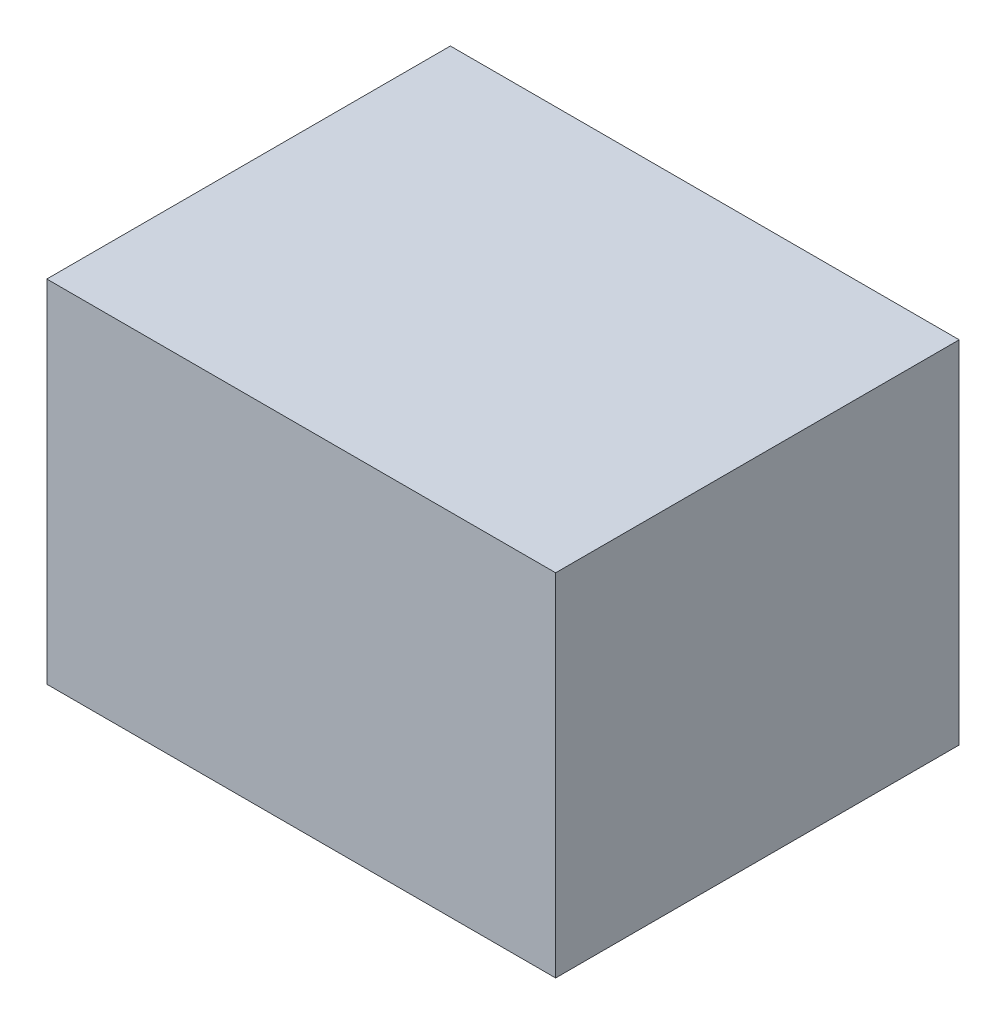
ISO-10303-21;
HEADER;
FILE_DESCRIPTION(('STEP AP214'),'2;1');
FILE_NAME('part.step','',(''),(''),'','','');
FILE_SCHEMA(('AUTOMOTIVE_DESIGN { 1 0 10303 214 1 1 1 1 }'));
ENDSEC;
DATA;
#1=APPLICATION_CONTEXT('core data for automotive mechanical design processes');
#2=APPLICATION_PROTOCOL_DEFINITION('international standard','automotive_design',2000,#1);
#3=PRODUCT_CONTEXT('',#1,'mechanical');
#4=PRODUCT('Part','Part','',(#3));
#5=PRODUCT_RELATED_PRODUCT_CATEGORY('part','',(#4));
#6=PRODUCT_DEFINITION_FORMATION('','',#4);
#7=PRODUCT_DEFINITION_CONTEXT('part definition',#1,'design');
#8=PRODUCT_DEFINITION('design','',#6,#7);
#9=PRODUCT_DEFINITION_SHAPE('','',#8);
#10=(LENGTH_UNIT() NAMED_UNIT(*) SI_UNIT(.MILLI.,.METRE.));
#11=(NAMED_UNIT(*) PLANE_ANGLE_UNIT() SI_UNIT($,.RADIAN.));
#12=(NAMED_UNIT(*) SI_UNIT($,.STERADIAN.) SOLID_ANGLE_UNIT());
#13=UNCERTAINTY_MEASURE_WITH_UNIT(LENGTH_MEASURE(1.E-05),#10,'distance_accuracy_value','');
#14=(GEOMETRIC_REPRESENTATION_CONTEXT(3) GLOBAL_UNCERTAINTY_ASSIGNED_CONTEXT((#13)) GLOBAL_UNIT_ASSIGNED_CONTEXT((#10,
#11,#12)) REPRESENTATION_CONTEXT('',''));
#15=CARTESIAN_POINT('',(0.,0.,0.));
#16=DIRECTION('',(0.,0.,1.));
#17=DIRECTION('',(1.,0.,0.));
#18=AXIS2_PLACEMENT_3D('',#15,#16,#17);
#19=CARTESIAN_POINT('',(-145.,200.,-115.));
#20=DIRECTION('',(1.,0.,0.));
#21=DIRECTION('',(0.,0.,-1.));
#22=AXIS2_PLACEMENT_3D('',#19,#20,#21);
#23=PLANE('',#22);
#24=DIRECTION('',(0.,0.,1.));
#25=VECTOR('',#24,1.);
#26=CARTESIAN_POINT('',(-145.,0.,-115.));
#27=LINE('',#26,#25);
#28=CARTESIAN_POINT('',(-145.,0.,-115.));
#29=VERTEX_POINT('',#28);
#30=CARTESIAN_POINT('',(-145.,0.,115.));
#31=VERTEX_POINT('',#30);
#32=EDGE_CURVE('E98',#29,#31,#27,.T.);
#33=ORIENTED_EDGE('',*,*,#32,.T.);
#34=DIRECTION('',(0.,-1.,0.));
#35=VECTOR('',#34,1.);
#36=CARTESIAN_POINT('',(-145.,200.,115.));
#37=LINE('',#36,#35);
#38=CARTESIAN_POINT('',(-145.,200.,115.));
#39=VERTEX_POINT('',#38);
#40=EDGE_CURVE('E11',#39,#31,#37,.T.);
#41=ORIENTED_EDGE('',*,*,#40,.F.);
#42=DIRECTION('',(0.,0.,1.));
#43=VECTOR('',#42,1.);
#44=CARTESIAN_POINT('',(-145.,200.,-115.));
#45=LINE('',#44,#43);
#46=CARTESIAN_POINT('',(-145.,200.,-115.));
#47=VERTEX_POINT('',#46);
#48=EDGE_CURVE('E84',#47,#39,#45,.T.);
#49=ORIENTED_EDGE('',*,*,#48,.F.);
#50=DIRECTION('',(0.,-1.,0.));
#51=VECTOR('',#50,1.);
#52=CARTESIAN_POINT('',(-145.,200.,-115.));
#53=LINE('',#52,#51);
#54=EDGE_CURVE('E51',#47,#29,#53,.T.);
#55=ORIENTED_EDGE('',*,*,#54,.T.);
#56=EDGE_LOOP('',(#33,#41,#49,#55));
#57=FACE_BOUND('',#56,.T.);
#58=ADVANCED_FACE('F35',(#57),#23,.F.);
#59=CARTESIAN_POINT('',(-145.,200.,115.));
#60=DIRECTION('',(0.,0.,-1.));
#61=DIRECTION('',(-1.,0.,0.));
#62=AXIS2_PLACEMENT_3D('',#59,#60,#61);
#63=PLANE('',#62);
#64=DIRECTION('',(1.,0.,0.));
#65=VECTOR('',#64,1.);
#66=CARTESIAN_POINT('',(-145.,0.,115.));
#67=LINE('',#66,#65);
#68=CARTESIAN_POINT('',(145.,0.,115.));
#69=VERTEX_POINT('',#68);
#70=EDGE_CURVE('E89',#31,#69,#67,.T.);
#71=ORIENTED_EDGE('',*,*,#70,.T.);
#72=DIRECTION('',(0.,-1.,0.));
#73=VECTOR('',#72,1.);
#74=CARTESIAN_POINT('',(145.,200.,115.));
#75=LINE('',#74,#73);
#76=CARTESIAN_POINT('',(145.,200.,115.));
#77=VERTEX_POINT('',#76);
#78=EDGE_CURVE('E43',#77,#69,#75,.T.);
#79=ORIENTED_EDGE('',*,*,#78,.F.);
#80=DIRECTION('',(1.,0.,0.));
#81=VECTOR('',#80,1.);
#82=CARTESIAN_POINT('',(-145.,200.,115.));
#83=LINE('',#82,#81);
#84=EDGE_CURVE('E76',#39,#77,#83,.T.);
#85=ORIENTED_EDGE('',*,*,#84,.F.);
#86=ORIENTED_EDGE('',*,*,#40,.T.);
#87=EDGE_LOOP('',(#71,#79,#85,#86));
#88=FACE_BOUND('',#87,.T.);
#89=ADVANCED_FACE('F88',(#88),#63,.F.);
#90=CARTESIAN_POINT('',(145.,200.,-115.));
#91=DIRECTION('',(1.,0.,0.));
#92=DIRECTION('',(0.,0.,-1.));
#93=AXIS2_PLACEMENT_3D('',#90,#91,#92);
#94=PLANE('',#93);
#95=DIRECTION('',(0.,0.,1.));
#96=VECTOR('',#95,1.);
#97=CARTESIAN_POINT('',(145.,0.,-115.));
#98=LINE('',#97,#96);
#99=CARTESIAN_POINT('',(145.,0.,-115.));
#100=VERTEX_POINT('',#99);
#101=EDGE_CURVE('E101',#100,#69,#98,.T.);
#102=ORIENTED_EDGE('',*,*,#101,.F.);
#103=DIRECTION('',(0.,-1.,0.));
#104=VECTOR('',#103,1.);
#105=CARTESIAN_POINT('',(145.,200.,-115.));
#106=LINE('',#105,#104);
#107=CARTESIAN_POINT('',(145.,200.,-115.));
#108=VERTEX_POINT('',#107);
#109=EDGE_CURVE('E65',#108,#100,#106,.T.);
#110=ORIENTED_EDGE('',*,*,#109,.F.);
#111=DIRECTION('',(0.,0.,1.));
#112=VECTOR('',#111,1.);
#113=CARTESIAN_POINT('',(145.,200.,-115.));
#114=LINE('',#113,#112);
#115=EDGE_CURVE('E83',#108,#77,#114,.T.);
#116=ORIENTED_EDGE('',*,*,#115,.T.);
#117=ORIENTED_EDGE('',*,*,#78,.T.);
#118=EDGE_LOOP('',(#102,#110,#116,#117));
#119=FACE_BOUND('',#118,.T.);
#120=ADVANCED_FACE('F92',(#119),#94,.T.);
#121=CARTESIAN_POINT('',(-145.,200.,-115.));
#122=DIRECTION('',(0.,0.,-1.));
#123=DIRECTION('',(-1.,0.,0.));
#124=AXIS2_PLACEMENT_3D('',#121,#122,#123);
#125=PLANE('',#124);
#126=DIRECTION('',(1.,0.,0.));
#127=VECTOR('',#126,1.);
#128=CARTESIAN_POINT('',(-145.,0.,-115.));
#129=LINE('',#128,#127);
#130=EDGE_CURVE('E103',#29,#100,#129,.T.);
#131=ORIENTED_EDGE('',*,*,#130,.F.);
#132=ORIENTED_EDGE('',*,*,#54,.F.);
#133=DIRECTION('',(1.,0.,0.));
#134=VECTOR('',#133,1.);
#135=CARTESIAN_POINT('',(-145.,200.,-115.));
#136=LINE('',#135,#134);
#137=EDGE_CURVE('E93',#47,#108,#136,.T.);
#138=ORIENTED_EDGE('',*,*,#137,.T.);
#139=ORIENTED_EDGE('',*,*,#109,.T.);
#140=EDGE_LOOP('',(#131,#132,#138,#139));
#141=FACE_BOUND('',#140,.T.);
#142=ADVANCED_FACE('F109',(#141),#125,.T.);
#143=CARTESIAN_POINT('',(0.,200.,0.));
#144=DIRECTION('',(0.,1.,0.));
#145=DIRECTION('',(0.,0.,1.));
#146=AXIS2_PLACEMENT_3D('',#143,#144,#145);
#147=PLANE('',#146);
#148=ORIENTED_EDGE('',*,*,#48,.T.);
#149=ORIENTED_EDGE('',*,*,#84,.T.);
#150=ORIENTED_EDGE('',*,*,#115,.F.);
#151=ORIENTED_EDGE('',*,*,#137,.F.);
#152=EDGE_LOOP('',(#148,#149,#150,#151));
#153=FACE_BOUND('',#152,.T.);
#154=ADVANCED_FACE('F80',(#153),#147,.T.);
#155=CARTESIAN_POINT('',(0.,0.,0.));
#156=DIRECTION('',(0.,1.,0.));
#157=DIRECTION('',(0.,0.,1.));
#158=AXIS2_PLACEMENT_3D('',#155,#156,#157);
#159=PLANE('',#158);
#160=ORIENTED_EDGE('',*,*,#32,.F.);
#161=ORIENTED_EDGE('',*,*,#130,.T.);
#162=ORIENTED_EDGE('',*,*,#101,.T.);
#163=ORIENTED_EDGE('',*,*,#70,.F.);
#164=EDGE_LOOP('',(#160,#161,#162,#163));
#165=FACE_BOUND('',#164,.T.);
#166=ADVANCED_FACE('F108',(#165),#159,.F.);
#167=CLOSED_SHELL('',(#58,#89,#120,#142,#154,#166));
#168=MANIFOLD_SOLID_BREP('B2',#167);
#169=ADVANCED_BREP_SHAPE_REPRESENTATION('',(#18,#168),#14);
#170=SHAPE_DEFINITION_REPRESENTATION(#9,#169);
ENDSEC;
END-ISO-10303-21;
